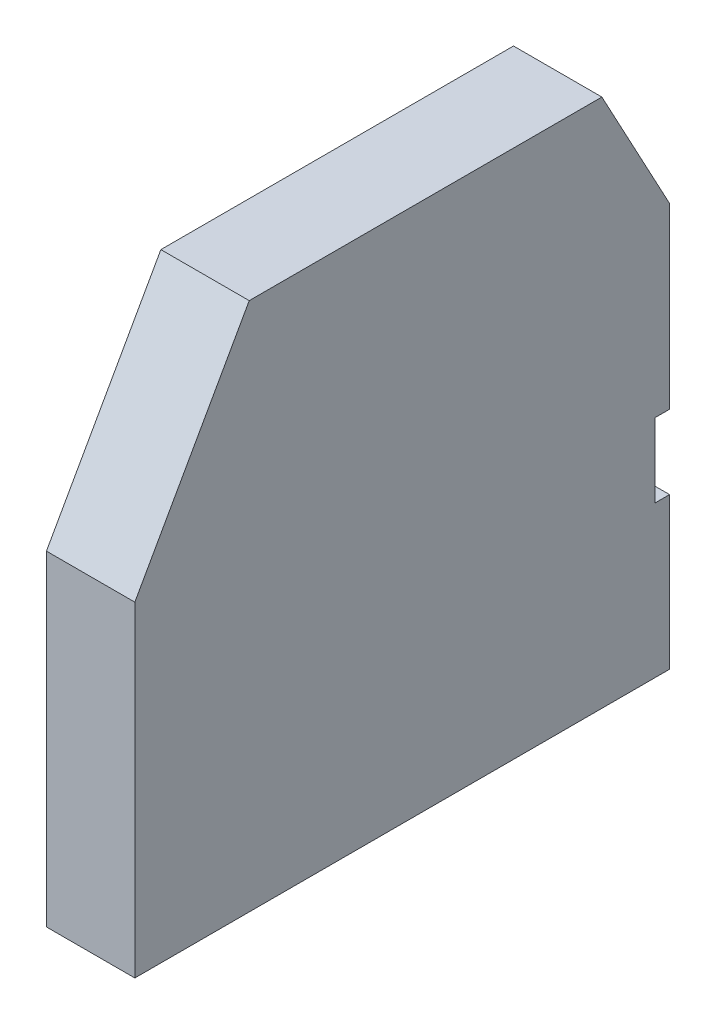
ISO-10303-21;
HEADER;
FILE_DESCRIPTION(('STEP AP214'),'2;1');
FILE_NAME('part.step','',(''),(''),'','','');
FILE_SCHEMA(('AUTOMOTIVE_DESIGN { 1 0 10303 214 1 1 1 1 }'));
ENDSEC;
DATA;
#1=APPLICATION_CONTEXT('core data for automotive mechanical design processes');
#2=APPLICATION_PROTOCOL_DEFINITION('international standard','automotive_design',2000,#1);
#3=PRODUCT_CONTEXT('',#1,'mechanical');
#4=PRODUCT('Part','Part','',(#3));
#5=PRODUCT_RELATED_PRODUCT_CATEGORY('part','',(#4));
#6=PRODUCT_DEFINITION_FORMATION('','',#4);
#7=PRODUCT_DEFINITION_CONTEXT('part definition',#1,'design');
#8=PRODUCT_DEFINITION('design','',#6,#7);
#9=PRODUCT_DEFINITION_SHAPE('','',#8);
#10=(LENGTH_UNIT() NAMED_UNIT(*) SI_UNIT(.MILLI.,.METRE.));
#11=(NAMED_UNIT(*) PLANE_ANGLE_UNIT() SI_UNIT($,.RADIAN.));
#12=(NAMED_UNIT(*) SI_UNIT($,.STERADIAN.) SOLID_ANGLE_UNIT());
#13=UNCERTAINTY_MEASURE_WITH_UNIT(LENGTH_MEASURE(1.E-05),#10,'distance_accuracy_value','');
#14=(GEOMETRIC_REPRESENTATION_CONTEXT(3) GLOBAL_UNCERTAINTY_ASSIGNED_CONTEXT((#13)) GLOBAL_UNIT_ASSIGNED_CONTEXT((#10,
#11,#12)) REPRESENTATION_CONTEXT('',''));
#15=CARTESIAN_POINT('',(0.,0.,0.));
#16=DIRECTION('',(0.,0.,1.));
#17=DIRECTION('',(1.,0.,0.));
#18=AXIS2_PLACEMENT_3D('',#15,#16,#17);
#19=CARTESIAN_POINT('',(-1.,13.2,-6.05));
#20=DIRECTION('',(0.,0.,1.));
#21=DIRECTION('',(1.,0.,0.));
#22=AXIS2_PLACEMENT_3D('',#19,#20,#21);
#23=PLANE('',#22);
#24=DIRECTION('',(0.,-1.,0.));
#25=VECTOR('',#24,1.);
#26=CARTESIAN_POINT('',(-1.,13.2,-6.05));
#27=LINE('',#26,#25);
#28=CARTESIAN_POINT('',(-1.,9.12973995271869,-6.05));
#29=VERTEX_POINT('',#28);
#30=CARTESIAN_POINT('',(-1.,5.09538807649045,-6.05));
#31=VERTEX_POINT('',#30);
#32=EDGE_CURVE('E169',#29,#31,#27,.T.);
#33=ORIENTED_EDGE('',*,*,#32,.F.);
#34=DIRECTION('',(-1.,0.,0.));
#35=VECTOR('',#34,1.);
#36=CARTESIAN_POINT('',(12.2,9.12973995271869,-6.05));
#37=LINE('',#36,#35);
#38=CARTESIAN_POINT('',(1.,9.12973995271869,-6.05));
#39=VERTEX_POINT('',#38);
#40=EDGE_CURVE('E138',#39,#29,#37,.T.);
#41=ORIENTED_EDGE('',*,*,#40,.F.);
#42=DIRECTION('',(0.,-1.,0.));
#43=VECTOR('',#42,1.);
#44=CARTESIAN_POINT('',(1.,13.2,-6.05));
#45=LINE('',#44,#43);
#46=CARTESIAN_POINT('',(1.,5.09538807649045,-6.05));
#47=VERTEX_POINT('',#46);
#48=EDGE_CURVE('E172',#39,#47,#45,.T.);
#49=ORIENTED_EDGE('',*,*,#48,.T.);
#50=DIRECTION('',(-1.,0.,0.));
#51=VECTOR('',#50,1.);
#52=CARTESIAN_POINT('',(-1.,5.09538807649045,-6.05));
#53=LINE('',#52,#51);
#54=EDGE_CURVE('E179',#47,#31,#53,.T.);
#55=ORIENTED_EDGE('',*,*,#54,.T.);
#56=EDGE_LOOP('',(#33,#41,#49,#55));
#57=FACE_BOUND('',#56,.T.);
#58=ADVANCED_FACE('F35',(#57),#23,.F.);
#59=CARTESIAN_POINT('',(-1.,13.2,-6.05));
#60=DIRECTION('',(1.,0.,0.));
#61=DIRECTION('',(0.,0.,-1.));
#62=AXIS2_PLACEMENT_3D('',#59,#60,#61);
#63=PLANE('',#62);
#64=DIRECTION('',(0.,0.,1.));
#65=VECTOR('',#64,1.);
#66=CARTESIAN_POINT('',(-1.,11.98,-4.51868200880614));
#67=LINE('',#66,#65);
#68=CARTESIAN_POINT('',(-1.,11.98,-4.51868200880614));
#69=VERTEX_POINT('',#68);
#70=CARTESIAN_POINT('',(-1.,11.98,3.46142283545497));
#71=VERTEX_POINT('',#70);
#72=EDGE_CURVE('E122',#69,#71,#67,.T.);
#73=ORIENTED_EDGE('',*,*,#72,.F.);
#74=DIRECTION('',(0.,0.88091418700611,0.473276024251561));
#75=VECTOR('',#74,1.);
#76=CARTESIAN_POINT('',(-1.,11.98,-4.51868200880614));
#77=LINE('',#76,#75);
#78=EDGE_CURVE('E119',#29,#69,#77,.T.);
#79=ORIENTED_EDGE('',*,*,#78,.F.);
#80=ORIENTED_EDGE('',*,*,#32,.T.);
#81=DIRECTION('',(0.,0.,-1.));
#82=VECTOR('',#81,1.);
#83=CARTESIAN_POINT('',(-1.,5.09538807649045,-6.05));
#84=LINE('',#83,#82);
#85=CARTESIAN_POINT('',(-1.,5.09538807649045,-5.71928508936383));
#86=VERTEX_POINT('',#85);
#87=EDGE_CURVE('E146',#86,#31,#84,.T.);
#88=ORIENTED_EDGE('',*,*,#87,.F.);
#89=DIRECTION('',(0.,1.,0.));
#90=VECTOR('',#89,1.);
#91=CARTESIAN_POINT('',(-1.,5.09538807649045,-5.71928508936383));
#92=LINE('',#91,#90);
#93=CARTESIAN_POINT('',(-1.,3.42359705036872,-5.71928508936383));
#94=VERTEX_POINT('',#93);
#95=EDGE_CURVE('E143',#94,#86,#92,.T.);
#96=ORIENTED_EDGE('',*,*,#95,.F.);
#97=DIRECTION('',(0.,0.,1.));
#98=VECTOR('',#97,1.);
#99=CARTESIAN_POINT('',(-1.,3.42359705036872,-6.05));
#100=LINE('',#99,#98);
#101=CARTESIAN_POINT('',(-1.,3.42359705036872,-6.05));
#102=VERTEX_POINT('',#101);
#103=EDGE_CURVE('E137',#102,#94,#100,.T.);
#104=ORIENTED_EDGE('',*,*,#103,.F.);
#105=CARTESIAN_POINT('',(-1.,0.,-6.05));
#106=VERTEX_POINT('',#105);
#107=EDGE_CURVE('E168',#102,#106,#27,.T.);
#108=ORIENTED_EDGE('',*,*,#107,.T.);
#109=DIRECTION('',(0.,0.,1.));
#110=VECTOR('',#109,1.);
#111=CARTESIAN_POINT('',(-1.,0.,-6.05));
#112=LINE('',#111,#110);
#113=CARTESIAN_POINT('',(-1.,0.,6.05));
#114=VERTEX_POINT('',#113);
#115=EDGE_CURVE('E157',#106,#114,#112,.T.);
#116=ORIENTED_EDGE('',*,*,#115,.T.);
#117=DIRECTION('',(0.,-1.,0.));
#118=VECTOR('',#117,1.);
#119=CARTESIAN_POINT('',(-1.,13.2,6.05));
#120=LINE('',#119,#118);
#121=CARTESIAN_POINT('',(-1.,7.36557919621751,6.05));
#122=VERTEX_POINT('',#121);
#123=EDGE_CURVE('E132',#122,#114,#120,.T.);
#124=ORIENTED_EDGE('',*,*,#123,.F.);
#125=DIRECTION('',(0.,-0.872143070108585,0.489250922596546));
#126=VECTOR('',#125,1.);
#127=CARTESIAN_POINT('',(-1.,11.98,3.46142283545497));
#128=LINE('',#127,#126);
#129=EDGE_CURVE('E115',#71,#122,#128,.T.);
#130=ORIENTED_EDGE('',*,*,#129,.F.);
#131=EDGE_LOOP('',(#73,#79,#80,#88,#96,#104,#108,#116,#124,#130));
#132=FACE_BOUND('',#131,.T.);
#133=ADVANCED_FACE('F37',(#132),#63,.F.);
#134=CARTESIAN_POINT('',(-1.,13.2,6.05));
#135=DIRECTION('',(0.,0.,-1.));
#136=DIRECTION('',(-1.,0.,0.));
#137=AXIS2_PLACEMENT_3D('',#134,#135,#136);
#138=PLANE('',#137);
#139=DIRECTION('',(0.,-1.,0.));
#140=VECTOR('',#139,1.);
#141=CARTESIAN_POINT('',(1.,13.2,6.05));
#142=LINE('',#141,#140);
#143=CARTESIAN_POINT('',(1.,7.36557919621751,6.05));
#144=VERTEX_POINT('',#143);
#145=CARTESIAN_POINT('',(1.,0.,6.05));
#146=VERTEX_POINT('',#145);
#147=EDGE_CURVE('E174',#144,#146,#142,.T.);
#148=ORIENTED_EDGE('',*,*,#147,.F.);
#149=DIRECTION('',(-1.,0.,0.));
#150=VECTOR('',#149,1.);
#151=CARTESIAN_POINT('',(12.2,7.36557919621751,6.05));
#152=LINE('',#151,#150);
#153=EDGE_CURVE('E50',#144,#122,#152,.T.);
#154=ORIENTED_EDGE('',*,*,#153,.T.);
#155=ORIENTED_EDGE('',*,*,#123,.T.);
#156=DIRECTION('',(1.,0.,0.));
#157=VECTOR('',#156,1.);
#158=CARTESIAN_POINT('',(-1.,0.,6.05));
#159=LINE('',#158,#157);
#160=EDGE_CURVE('E159',#114,#146,#159,.T.);
#161=ORIENTED_EDGE('',*,*,#160,.T.);
#162=EDGE_LOOP('',(#148,#154,#155,#161));
#163=FACE_BOUND('',#162,.T.);
#164=ADVANCED_FACE('F215',(#163),#138,.F.);
#165=CARTESIAN_POINT('',(1.,13.2,-6.05));
#166=DIRECTION('',(-1.,0.,0.));
#167=DIRECTION('',(0.,0.,1.));
#168=AXIS2_PLACEMENT_3D('',#165,#166,#167);
#169=PLANE('',#168);
#170=ORIENTED_EDGE('',*,*,#48,.F.);
#171=DIRECTION('',(0.,0.88091418700611,0.473276024251561));
#172=VECTOR('',#171,1.);
#173=CARTESIAN_POINT('',(1.,12.2883016577741,-4.35304523621951));
#174=LINE('',#173,#172);
#175=CARTESIAN_POINT('',(1.,11.98,-4.51868200880614));
#176=VERTEX_POINT('',#175);
#177=EDGE_CURVE('E11',#39,#176,#174,.T.);
#178=ORIENTED_EDGE('',*,*,#177,.T.);
#179=DIRECTION('',(0.,0.,1.));
#180=VECTOR('',#179,1.);
#181=CARTESIAN_POINT('',(1.,11.98,-6.05));
#182=LINE('',#181,#180);
#183=CARTESIAN_POINT('',(1.,11.98,3.46142283545497));
#184=VERTEX_POINT('',#183);
#185=EDGE_CURVE('E43',#176,#184,#182,.T.);
#186=ORIENTED_EDGE('',*,*,#185,.T.);
#187=DIRECTION('',(0.,-0.872143070108585,0.489250922596546));
#188=VECTOR('',#187,1.);
#189=CARTESIAN_POINT('',(1.,16.9664666157604,0.664137073666007));
#190=LINE('',#189,#188);
#191=EDGE_CURVE('E116',#184,#144,#190,.T.);
#192=ORIENTED_EDGE('',*,*,#191,.T.);
#193=ORIENTED_EDGE('',*,*,#147,.T.);
#194=DIRECTION('',(0.,0.,-1.));
#195=VECTOR('',#194,1.);
#196=CARTESIAN_POINT('',(1.,0.,-6.05));
#197=LINE('',#196,#195);
#198=CARTESIAN_POINT('',(1.,0.,-6.05));
#199=VERTEX_POINT('',#198);
#200=EDGE_CURVE('E162',#146,#199,#197,.T.);
#201=ORIENTED_EDGE('',*,*,#200,.T.);
#202=CARTESIAN_POINT('',(1.,3.42359705036872,-6.05));
#203=VERTEX_POINT('',#202);
#204=EDGE_CURVE('E171',#203,#199,#45,.T.);
#205=ORIENTED_EDGE('',*,*,#204,.F.);
#206=DIRECTION('',(0.,0.,1.));
#207=VECTOR('',#206,1.);
#208=CARTESIAN_POINT('',(1.,3.42359705036872,-6.05));
#209=LINE('',#208,#207);
#210=CARTESIAN_POINT('',(1.,3.42359705036872,-5.71928508936383));
#211=VERTEX_POINT('',#210);
#212=EDGE_CURVE('E58',#203,#211,#209,.T.);
#213=ORIENTED_EDGE('',*,*,#212,.T.);
#214=DIRECTION('',(0.,1.,0.));
#215=VECTOR('',#214,1.);
#216=CARTESIAN_POINT('',(1.,13.2,-5.71928508936383));
#217=LINE('',#216,#215);
#218=CARTESIAN_POINT('',(1.,5.09538807649045,-5.71928508936383));
#219=VERTEX_POINT('',#218);
#220=EDGE_CURVE('E182',#211,#219,#217,.T.);
#221=ORIENTED_EDGE('',*,*,#220,.T.);
#222=DIRECTION('',(0.,0.,-1.));
#223=VECTOR('',#222,1.);
#224=CARTESIAN_POINT('',(1.,5.09538807649045,-6.05));
#225=LINE('',#224,#223);
#226=EDGE_CURVE('E154',#219,#47,#225,.T.);
#227=ORIENTED_EDGE('',*,*,#226,.T.);
#228=EDGE_LOOP('',(#170,#178,#186,#192,#193,#201,#205,#213,#221,#227));
#229=FACE_BOUND('',#228,.T.);
#230=ADVANCED_FACE('F187',(#229),#169,.F.);
#231=ORIENTED_EDGE('',*,*,#107,.F.);
#232=DIRECTION('',(1.,0.,0.));
#233=VECTOR('',#232,1.);
#234=CARTESIAN_POINT('',(-1.,3.42359705036872,-6.05));
#235=LINE('',#234,#233);
#236=EDGE_CURVE('E177',#102,#203,#235,.T.);
#237=ORIENTED_EDGE('',*,*,#236,.T.);
#238=ORIENTED_EDGE('',*,*,#204,.T.);
#239=DIRECTION('',(-1.,0.,0.));
#240=VECTOR('',#239,1.);
#241=CARTESIAN_POINT('',(-1.,0.,-6.05));
#242=LINE('',#241,#240);
#243=EDGE_CURVE('E165',#199,#106,#242,.T.);
#244=ORIENTED_EDGE('',*,*,#243,.T.);
#245=EDGE_LOOP('',(#231,#237,#238,#244));
#246=FACE_BOUND('',#245,.T.);
#247=ADVANCED_FACE('F207',(#246),#23,.F.);
#248=CARTESIAN_POINT('',(0.,0.,0.));
#249=DIRECTION('',(0.,1.,0.));
#250=DIRECTION('',(0.,0.,1.));
#251=AXIS2_PLACEMENT_3D('',#248,#249,#250);
#252=PLANE('',#251);
#253=ORIENTED_EDGE('',*,*,#115,.F.);
#254=ORIENTED_EDGE('',*,*,#243,.F.);
#255=ORIENTED_EDGE('',*,*,#200,.F.);
#256=ORIENTED_EDGE('',*,*,#160,.F.);
#257=EDGE_LOOP('',(#253,#254,#255,#256));
#258=FACE_BOUND('',#257,.T.);
#259=ADVANCED_FACE('F213',(#258),#252,.F.);
#260=CARTESIAN_POINT('',(12.2,5.09538807649045,-5.71928508936383));
#261=DIRECTION('',(0.,0.,1.));
#262=DIRECTION('',(1.,0.,0.));
#263=AXIS2_PLACEMENT_3D('',#260,#261,#262);
#264=PLANE('',#263);
#265=DIRECTION('',(-1.,0.,0.));
#266=VECTOR('',#265,1.);
#267=CARTESIAN_POINT('',(12.2,3.42359705036872,-5.71928508936383));
#268=LINE('',#267,#266);
#269=EDGE_CURVE('E149',#211,#94,#268,.T.);
#270=ORIENTED_EDGE('',*,*,#269,.T.);
#271=ORIENTED_EDGE('',*,*,#95,.T.);
#272=DIRECTION('',(-1.,0.,0.));
#273=VECTOR('',#272,1.);
#274=CARTESIAN_POINT('',(12.2,5.09538807649045,-5.71928508936383));
#275=LINE('',#274,#273);
#276=EDGE_CURVE('E150',#219,#86,#275,.T.);
#277=ORIENTED_EDGE('',*,*,#276,.F.);
#278=ORIENTED_EDGE('',*,*,#220,.F.);
#279=EDGE_LOOP('',(#270,#271,#277,#278));
#280=FACE_BOUND('',#279,.T.);
#281=ADVANCED_FACE('F201',(#280),#264,.F.);
#282=CARTESIAN_POINT('',(12.2,5.09538807649045,-6.05));
#283=DIRECTION('',(0.,1.,0.));
#284=DIRECTION('',(0.,0.,1.));
#285=AXIS2_PLACEMENT_3D('',#282,#283,#284);
#286=PLANE('',#285);
#287=ORIENTED_EDGE('',*,*,#276,.T.);
#288=ORIENTED_EDGE('',*,*,#87,.T.);
#289=ORIENTED_EDGE('',*,*,#54,.F.);
#290=ORIENTED_EDGE('',*,*,#226,.F.);
#291=EDGE_LOOP('',(#287,#288,#289,#290));
#292=FACE_BOUND('',#291,.T.);
#293=ADVANCED_FACE('F197',(#292),#286,.F.);
#294=CARTESIAN_POINT('',(12.2,3.42359705036872,-6.05));
#295=DIRECTION('',(0.,-1.,0.));
#296=DIRECTION('',(0.,0.,-1.));
#297=AXIS2_PLACEMENT_3D('',#294,#295,#296);
#298=PLANE('',#297);
#299=ORIENTED_EDGE('',*,*,#236,.F.);
#300=ORIENTED_EDGE('',*,*,#103,.T.);
#301=ORIENTED_EDGE('',*,*,#269,.F.);
#302=ORIENTED_EDGE('',*,*,#212,.F.);
#303=EDGE_LOOP('',(#299,#300,#301,#302));
#304=FACE_BOUND('',#303,.T.);
#305=ADVANCED_FACE('F202',(#304),#298,.F.);
#306=CARTESIAN_POINT('',(12.2,11.98,-4.51868200880614));
#307=DIRECTION('',(0.,-1.,0.));
#308=DIRECTION('',(0.,0.,-1.));
#309=AXIS2_PLACEMENT_3D('',#306,#307,#308);
#310=PLANE('',#309);
#311=DIRECTION('',(-1.,0.,0.));
#312=VECTOR('',#311,1.);
#313=CARTESIAN_POINT('',(12.2,11.98,-4.51868200880614));
#314=LINE('',#313,#312);
#315=EDGE_CURVE('E125',#176,#69,#314,.T.);
#316=ORIENTED_EDGE('',*,*,#315,.T.);
#317=ORIENTED_EDGE('',*,*,#72,.T.);
#318=DIRECTION('',(-1.,0.,0.));
#319=VECTOR('',#318,1.);
#320=CARTESIAN_POINT('',(12.2,11.98,3.46142283545497));
#321=LINE('',#320,#319);
#322=EDGE_CURVE('E111',#184,#71,#321,.T.);
#323=ORIENTED_EDGE('',*,*,#322,.F.);
#324=ORIENTED_EDGE('',*,*,#185,.F.);
#325=EDGE_LOOP('',(#316,#317,#323,#324));
#326=FACE_BOUND('',#325,.T.);
#327=ADVANCED_FACE('F123',(#326),#310,.F.);
#328=CARTESIAN_POINT('',(12.2,11.98,-4.51868200880614));
#329=DIRECTION('',(0.,-0.473276024251561,0.88091418700611));
#330=DIRECTION('',(0.,-0.88091418700611,-0.473276024251561));
#331=AXIS2_PLACEMENT_3D('',#328,#329,#330);
#332=PLANE('',#331);
#333=ORIENTED_EDGE('',*,*,#40,.T.);
#334=ORIENTED_EDGE('',*,*,#78,.T.);
#335=ORIENTED_EDGE('',*,*,#315,.F.);
#336=ORIENTED_EDGE('',*,*,#177,.F.);
#337=EDGE_LOOP('',(#333,#334,#335,#336));
#338=FACE_BOUND('',#337,.T.);
#339=ADVANCED_FACE('F190',(#338),#332,.F.);
#340=CARTESIAN_POINT('',(12.2,11.98,3.46142283545497));
#341=DIRECTION('',(0.,-0.489250922596546,-0.872143070108585));
#342=DIRECTION('',(0.,0.872143070108585,-0.489250922596546));
#343=AXIS2_PLACEMENT_3D('',#340,#341,#342);
#344=PLANE('',#343);
#345=ORIENTED_EDGE('',*,*,#322,.T.);
#346=ORIENTED_EDGE('',*,*,#129,.T.);
#347=ORIENTED_EDGE('',*,*,#153,.F.);
#348=ORIENTED_EDGE('',*,*,#191,.F.);
#349=EDGE_LOOP('',(#345,#346,#347,#348));
#350=FACE_BOUND('',#349,.T.);
#351=ADVANCED_FACE('F113',(#350),#344,.F.);
#352=CLOSED_SHELL('',(#58,#133,#164,#230,#247,#259,#281,#293,#305,#327,#339,#351));
#353=MANIFOLD_SOLID_BREP('B2',#352);
#354=ADVANCED_BREP_SHAPE_REPRESENTATION('',(#18,#353),#14);
#355=SHAPE_DEFINITION_REPRESENTATION(#9,#354);
ENDSEC;
END-ISO-10303-21;
